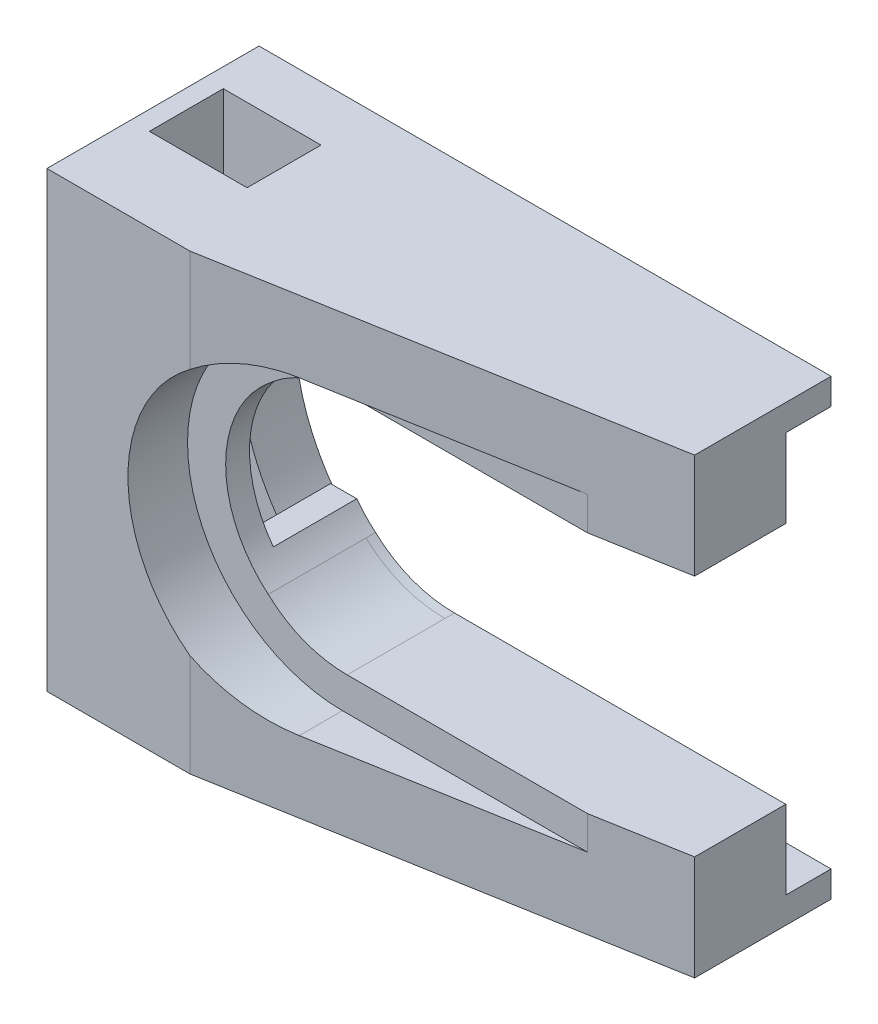
ISO-10303-21;
HEADER;
FILE_DESCRIPTION(('STEP AP214'),'2;1');
FILE_NAME('part.step','',(''),(''),'','','');
FILE_SCHEMA(('AUTOMOTIVE_DESIGN { 1 0 10303 214 1 1 1 1 }'));
ENDSEC;
DATA;
#1=APPLICATION_CONTEXT('core data for automotive mechanical design processes');
#2=APPLICATION_PROTOCOL_DEFINITION('international standard','automotive_design',2000,#1);
#3=PRODUCT_CONTEXT('',#1,'mechanical');
#4=PRODUCT('Part','Part','',(#3));
#5=PRODUCT_RELATED_PRODUCT_CATEGORY('part','',(#4));
#6=PRODUCT_DEFINITION_FORMATION('','',#4);
#7=PRODUCT_DEFINITION_CONTEXT('part definition',#1,'design');
#8=PRODUCT_DEFINITION('design','',#6,#7);
#9=PRODUCT_DEFINITION_SHAPE('','',#8);
#10=(LENGTH_UNIT() NAMED_UNIT(*) SI_UNIT(.MILLI.,.METRE.));
#11=(NAMED_UNIT(*) PLANE_ANGLE_UNIT() SI_UNIT($,.RADIAN.));
#12=(NAMED_UNIT(*) SI_UNIT($,.STERADIAN.) SOLID_ANGLE_UNIT());
#13=UNCERTAINTY_MEASURE_WITH_UNIT(LENGTH_MEASURE(1.E-05),#10,'distance_accuracy_value','');
#14=(GEOMETRIC_REPRESENTATION_CONTEXT(3) GLOBAL_UNCERTAINTY_ASSIGNED_CONTEXT((#13)) GLOBAL_UNIT_ASSIGNED_CONTEXT((#10,
#11,#12)) REPRESENTATION_CONTEXT('',''));
#15=CARTESIAN_POINT('',(0.,0.,0.));
#16=DIRECTION('',(0.,0.,1.));
#17=DIRECTION('',(1.,0.,0.));
#18=AXIS2_PLACEMENT_3D('',#15,#16,#17);
#19=CARTESIAN_POINT('',(12.,-9.5,33.));
#20=DIRECTION('',(-1.,0.,0.));
#21=DIRECTION('',(0.,0.,1.));
#22=AXIS2_PLACEMENT_3D('',#19,#20,#21);
#23=PLANE('',#22);
#24=DIRECTION('',(0.,0.,1.));
#25=VECTOR('',#24,1.);
#26=CARTESIAN_POINT('',(12.,8.4,23.1));
#27=LINE('',#26,#25);
#28=CARTESIAN_POINT('',(12.,8.4,23.1));
#29=VERTEX_POINT('',#28);
#30=CARTESIAN_POINT('',(12.,8.4,25.));
#31=VERTEX_POINT('',#30);
#32=EDGE_CURVE('E283',#29,#31,#27,.T.);
#33=ORIENTED_EDGE('',*,*,#32,.F.);
#34=DIRECTION('',(0.,1.,0.));
#35=VECTOR('',#34,1.);
#36=CARTESIAN_POINT('',(12.,-9.5,23.1));
#37=LINE('',#36,#35);
#38=CARTESIAN_POINT('',(12.,9.5,23.1));
#39=VERTEX_POINT('',#38);
#40=EDGE_CURVE('E345',#29,#39,#37,.T.);
#41=ORIENTED_EDGE('',*,*,#40,.T.);
#42=DIRECTION('',(0.,0.,-1.));
#43=VECTOR('',#42,1.);
#44=CARTESIAN_POINT('',(12.,9.5,33.));
#45=LINE('',#44,#43);
#46=CARTESIAN_POINT('',(12.,9.5,28.8261143472478));
#47=VERTEX_POINT('',#46);
#48=EDGE_CURVE('E618',#47,#39,#45,.T.);
#49=ORIENTED_EDGE('',*,*,#48,.F.);
#50=DIRECTION('',(0.,-1.,0.));
#51=VECTOR('',#50,1.);
#52=CARTESIAN_POINT('',(12.,9.5,28.8261143472478));
#53=LINE('',#52,#51);
#54=CARTESIAN_POINT('',(12.,5.1,28.8261143472478));
#55=VERTEX_POINT('',#54);
#56=EDGE_CURVE('E470',#47,#55,#53,.T.);
#57=ORIENTED_EDGE('',*,*,#56,.T.);
#58=DIRECTION('',(0.,0.,1.));
#59=VECTOR('',#58,1.);
#60=CARTESIAN_POINT('',(12.,5.1,-0.001000000000001));
#61=LINE('',#60,#59);
#62=CARTESIAN_POINT('',(12.,5.1,25.));
#63=VERTEX_POINT('',#62);
#64=EDGE_CURVE('E603',#63,#55,#61,.T.);
#65=ORIENTED_EDGE('',*,*,#64,.F.);
#66=DIRECTION('',(0.,-1.,0.));
#67=VECTOR('',#66,1.);
#68=CARTESIAN_POINT('',(12.,8.4,25.));
#69=LINE('',#68,#67);
#70=EDGE_CURVE('E349',#31,#63,#69,.T.);
#71=ORIENTED_EDGE('',*,*,#70,.F.);
#72=EDGE_LOOP('',(#33,#41,#49,#57,#65,#71));
#73=FACE_BOUND('',#72,.T.);
#74=ADVANCED_FACE('F45',(#73),#23,.F.);
#75=CARTESIAN_POINT('',(-2.,0.,23.1));
#76=DIRECTION('',(0.,0.,1.));
#77=DIRECTION('',(1.,0.,0.));
#78=AXIS2_PLACEMENT_3D('',#75,#76,#77);
#79=CYLINDRICAL_SURFACE('',#78,8.5);
#80=DIRECTION('',(0.,0.,1.));
#81=VECTOR('',#80,1.);
#82=CARTESIAN_POINT('',(-7.1,6.8,16.5613982200841));
#83=LINE('',#82,#81);
#84=CARTESIAN_POINT('',(-7.1,6.8,25.));
#85=VERTEX_POINT('',#84);
#86=CARTESIAN_POINT('',(-7.1,6.8,25.4));
#87=VERTEX_POINT('',#86);
#88=EDGE_CURVE('E664',#85,#87,#83,.T.);
#89=ORIENTED_EDGE('',*,*,#88,.T.);
#90=CARTESIAN_POINT('',(-2.,0.,25.4));
#91=DIRECTION('',(0.,0.,1.));
#92=DIRECTION('',(1.,0.,0.));
#93=AXIS2_PLACEMENT_3D('',#90,#91,#92);
#94=CIRCLE('',#93,8.5);
#95=CARTESIAN_POINT('',(-7.1,-6.8,25.4));
#96=VERTEX_POINT('',#95);
#97=EDGE_CURVE('E404',#87,#96,#94,.T.);
#98=ORIENTED_EDGE('',*,*,#97,.T.);
#99=DIRECTION('',(0.,0.,1.));
#100=VECTOR('',#99,1.);
#101=CARTESIAN_POINT('',(-7.1,-6.8,16.5613982200841));
#102=LINE('',#101,#100);
#103=CARTESIAN_POINT('',(-7.1,-6.8,25.));
#104=VERTEX_POINT('',#103);
#105=EDGE_CURVE('E505',#104,#96,#102,.T.);
#106=ORIENTED_EDGE('',*,*,#105,.F.);
#107=CARTESIAN_POINT('',(-2.,0.,25.));
#108=DIRECTION('',(0.,0.,1.));
#109=DIRECTION('',(1.,0.,0.));
#110=AXIS2_PLACEMENT_3D('',#107,#108,#109);
#111=CIRCLE('',#110,8.5);
#112=CARTESIAN_POINT('',(-0.700000000000006,-8.4,25.));
#113=VERTEX_POINT('',#112);
#114=EDGE_CURVE('E487',#104,#113,#111,.T.);
#115=ORIENTED_EDGE('',*,*,#114,.T.);
#116=DIRECTION('',(0.,0.,1.));
#117=VECTOR('',#116,1.);
#118=CARTESIAN_POINT('',(-0.700000000000001,-8.4,23.1));
#119=LINE('',#118,#117);
#120=CARTESIAN_POINT('',(-0.700000000000001,-8.4,23.1));
#121=VERTEX_POINT('',#120);
#122=EDGE_CURVE('E284',#121,#113,#119,.T.);
#123=ORIENTED_EDGE('',*,*,#122,.F.);
#124=CARTESIAN_POINT('',(-2.,0.,23.1));
#125=DIRECTION('',(0.,0.,1.));
#126=DIRECTION('',(1.,0.,0.));
#127=AXIS2_PLACEMENT_3D('',#124,#125,#126);
#128=CIRCLE('',#127,8.5);
#129=CARTESIAN_POINT('',(-0.700000000000001,8.4,23.1));
#130=VERTEX_POINT('',#129);
#131=EDGE_CURVE('E261',#130,#121,#128,.T.);
#132=ORIENTED_EDGE('',*,*,#131,.F.);
#133=DIRECTION('',(0.,0.,1.));
#134=VECTOR('',#133,1.);
#135=CARTESIAN_POINT('',(-0.700000000000001,8.4,23.1));
#136=LINE('',#135,#134);
#137=CARTESIAN_POINT('',(-0.7,8.4,25.));
#138=VERTEX_POINT('',#137);
#139=EDGE_CURVE('E287',#130,#138,#136,.T.);
#140=ORIENTED_EDGE('',*,*,#139,.T.);
#141=CARTESIAN_POINT('',(-2.,0.,25.));
#142=DIRECTION('',(0.,0.,1.));
#143=DIRECTION('',(1.,0.,0.));
#144=AXIS2_PLACEMENT_3D('',#141,#142,#143);
#145=CIRCLE('',#144,8.5);
#146=EDGE_CURVE('E364',#138,#85,#145,.T.);
#147=ORIENTED_EDGE('',*,*,#146,.T.);
#148=EDGE_LOOP('',(#89,#98,#106,#115,#123,#132,#140,#147));
#149=FACE_BOUND('',#148,.T.);
#150=ADVANCED_FACE('F319',(#149),#79,.F.);
#151=DIRECTION('',(0.,0.,-1.));
#152=VECTOR('',#151,1.);
#153=CARTESIAN_POINT('',(12.,-9.5,33.));
#154=LINE('',#153,#152);
#155=CARTESIAN_POINT('',(12.,-9.5,28.8261143472478));
#156=VERTEX_POINT('',#155);
#157=CARTESIAN_POINT('',(12.,-9.5,23.1));
#158=VERTEX_POINT('',#157);
#159=EDGE_CURVE('E276',#156,#158,#154,.T.);
#160=ORIENTED_EDGE('',*,*,#159,.T.);
#161=DIRECTION('',(0.,1.,0.));
#162=VECTOR('',#161,1.);
#163=CARTESIAN_POINT('',(12.,-9.5,23.1));
#164=LINE('',#163,#162);
#165=CARTESIAN_POINT('',(12.,-8.4,23.1));
#166=VERTEX_POINT('',#165);
#167=EDGE_CURVE('E258',#158,#166,#164,.T.);
#168=ORIENTED_EDGE('',*,*,#167,.T.);
#169=DIRECTION('',(0.,0.,1.));
#170=VECTOR('',#169,1.);
#171=CARTESIAN_POINT('',(12.,-8.4,23.1));
#172=LINE('',#171,#170);
#173=CARTESIAN_POINT('',(12.,-8.4,25.));
#174=VERTEX_POINT('',#173);
#175=EDGE_CURVE('E273',#166,#174,#172,.T.);
#176=ORIENTED_EDGE('',*,*,#175,.T.);
#177=CARTESIAN_POINT('',(12.,-5.1,25.));
#178=VERTEX_POINT('',#177);
#179=EDGE_CURVE('E361',#178,#174,#69,.T.);
#180=ORIENTED_EDGE('',*,*,#179,.F.);
#181=DIRECTION('',(0.,0.,1.));
#182=VECTOR('',#181,1.);
#183=CARTESIAN_POINT('',(12.,-5.1,-0.001000000000001));
#184=LINE('',#183,#182);
#185=CARTESIAN_POINT('',(12.,-5.1,28.8261143472478));
#186=VERTEX_POINT('',#185);
#187=EDGE_CURVE('E600',#178,#186,#184,.T.);
#188=ORIENTED_EDGE('',*,*,#187,.T.);
#189=EDGE_CURVE('E473',#186,#156,#53,.T.);
#190=ORIENTED_EDGE('',*,*,#189,.T.);
#191=EDGE_LOOP('',(#160,#168,#176,#180,#188,#190));
#192=FACE_BOUND('',#191,.T.);
#193=ADVANCED_FACE('F271',(#192),#23,.F.);
#194=CARTESIAN_POINT('',(-1.9,5.1,-0.001000000000001));
#195=CARTESIAN_POINT('',(-3.82912407346353,5.09320531687045,-0.001000000000001));
#196=CARTESIAN_POINT('',(-5.21393804843269,3.8302222155949,-0.001000000000001));
#197=B_SPLINE_CURVE_WITH_KNOTS('',2,(#194,#195,#196),.UNSPECIFIED.,.F.,.F.,(3,3),(0.,1.),.UNSPECIFIED.);
#198=DIRECTION('',(0.,0.,1.));
#199=VECTOR('',#198,1.);
#200=SURFACE_OF_LINEAR_EXTRUSION('',#197,#199);
#201=CARTESIAN_POINT('',(-1.9,5.1,29.5));
#202=CARTESIAN_POINT('',(-3.82912407346353,5.09320531687045,29.5));
#203=CARTESIAN_POINT('',(-5.21393804843269,3.8302222155949,29.5));
#204=B_SPLINE_CURVE_WITH_KNOTS('',2,(#201,#202,#203),.UNSPECIFIED.,.F.,.F.,(3,3),(0.,1.),.UNSPECIFIED.);
#205=CARTESIAN_POINT('',(-5.21393804843269,3.8302222155949,29.5));
#206=VERTEX_POINT('',#205);
#207=CARTESIAN_POINT('',(-1.9,5.1,29.5));
#208=VERTEX_POINT('',#207);
#209=EDGE_CURVE('E412',#206,#208,#204,.F.);
#210=ORIENTED_EDGE('',*,*,#209,.F.);
#211=DIRECTION('',(0.,0.,1.));
#212=VECTOR('',#211,1.);
#213=CARTESIAN_POINT('',(-5.21393804843269,3.8302222155949,-0.001000000000001));
#214=LINE('',#213,#212);
#215=CARTESIAN_POINT('',(-5.21393804843269,3.8302222155949,25.4));
#216=VERTEX_POINT('',#215);
#217=EDGE_CURVE('E296',#216,#206,#214,.T.);
#218=ORIENTED_EDGE('',*,*,#217,.F.);
#219=CARTESIAN_POINT('',(-1.9,5.1,25.4));
#220=CARTESIAN_POINT('',(-3.82912407346353,5.09320531687045,25.4));
#221=CARTESIAN_POINT('',(-5.21393804843269,3.8302222155949,25.4));
#222=B_SPLINE_CURVE_WITH_KNOTS('',2,(#219,#220,#221),.UNSPECIFIED.,.F.,.F.,(3,3),(0.,1.),.UNSPECIFIED.);
#223=CARTESIAN_POINT('',(-1.9,5.1,25.4));
#224=VERTEX_POINT('',#223);
#225=EDGE_CURVE('E407',#224,#216,#222,.T.);
#226=ORIENTED_EDGE('',*,*,#225,.F.);
#227=DIRECTION('',(0.,0.,1.));
#228=VECTOR('',#227,1.);
#229=CARTESIAN_POINT('',(-1.9,5.1,-0.001000000000001));
#230=LINE('',#229,#228);
#231=EDGE_CURVE('E610',#224,#208,#230,.T.);
#232=ORIENTED_EDGE('',*,*,#231,.T.);
#233=EDGE_LOOP('',(#210,#218,#226,#232));
#234=FACE_BOUND('',#233,.T.);
#235=ADVANCED_FACE('F309',(#234),#200,.F.);
#236=CARTESIAN_POINT('',(-1.9,5.1,-0.001000000000001));
#237=DIRECTION('',(0.,1.,0.));
#238=DIRECTION('',(0.,0.,1.));
#239=AXIS2_PLACEMENT_3D('',#236,#237,#238);
#240=PLANE('',#239);
#241=ORIENTED_EDGE('',*,*,#231,.F.);
#242=DIRECTION('',(0.,0.,1.));
#243=VECTOR('',#242,1.);
#244=CARTESIAN_POINT('',(-1.9,5.1,16.5613982200841));
#245=LINE('',#244,#243);
#246=CARTESIAN_POINT('',(-1.9000000000069,5.10000000009578,25.));
#247=VERTEX_POINT('',#246);
#248=EDGE_CURVE('E659',#247,#224,#245,.T.);
#249=ORIENTED_EDGE('',*,*,#248,.F.);
#250=DIRECTION('',(1.,0.,0.));
#251=VECTOR('',#250,1.);
#252=CARTESIAN_POINT('',(-1.9,5.1,25.));
#253=LINE('',#252,#251);
#254=EDGE_CURVE('E294',#247,#63,#253,.T.);
#255=ORIENTED_EDGE('',*,*,#254,.T.);
#256=ORIENTED_EDGE('',*,*,#64,.T.);
#257=DIRECTION('',(-0.984807753012209,0.,0.173648177666923));
#258=VECTOR('',#257,1.);
#259=CARTESIAN_POINT('',(3.44886317589326,5.1,30.3339104850674));
#260=LINE('',#259,#258);
#261=CARTESIAN_POINT('',(8.17820454904488,5.1,29.5));
#262=VERTEX_POINT('',#261);
#263=EDGE_CURVE('E460',#55,#262,#260,.T.);
#264=ORIENTED_EDGE('',*,*,#263,.T.);
#265=DIRECTION('',(1.,0.,0.));
#266=VECTOR('',#265,1.);
#267=CARTESIAN_POINT('',(-1.9,5.1,29.5));
#268=LINE('',#267,#266);
#269=EDGE_CURVE('E408',#208,#262,#268,.T.);
#270=ORIENTED_EDGE('',*,*,#269,.F.);
#271=EDGE_LOOP('',(#241,#249,#255,#256,#264,#270));
#272=FACE_BOUND('',#271,.T.);
#273=ADVANCED_FACE('F313',(#272),#240,.F.);
#274=CARTESIAN_POINT('',(-1.9,-5.1,-0.001000000000001));
#275=DIRECTION('',(0.,-1.,0.));
#276=DIRECTION('',(0.,0.,-1.));
#277=AXIS2_PLACEMENT_3D('',#274,#275,#276);
#278=PLANE('',#277);
#279=DIRECTION('',(-1.,0.,0.));
#280=VECTOR('',#279,1.);
#281=CARTESIAN_POINT('',(-1.9,-5.1,29.5));
#282=LINE('',#281,#280);
#283=CARTESIAN_POINT('',(8.17820454904488,-5.1,29.5));
#284=VERTEX_POINT('',#283);
#285=CARTESIAN_POINT('',(-1.9,-5.1,29.5));
#286=VERTEX_POINT('',#285);
#287=EDGE_CURVE('E416',#284,#286,#282,.T.);
#288=ORIENTED_EDGE('',*,*,#287,.F.);
#289=DIRECTION('',(0.984807753012209,0.,-0.173648177666923));
#290=VECTOR('',#289,1.);
#291=CARTESIAN_POINT('',(3.44886317589326,-5.1,30.3339104850674));
#292=LINE('',#291,#290);
#293=EDGE_CURVE('E452',#284,#186,#292,.T.);
#294=ORIENTED_EDGE('',*,*,#293,.T.);
#295=ORIENTED_EDGE('',*,*,#187,.F.);
#296=DIRECTION('',(-1.,0.,0.));
#297=VECTOR('',#296,1.);
#298=CARTESIAN_POINT('',(-1.9,-5.1,25.));
#299=LINE('',#298,#297);
#300=CARTESIAN_POINT('',(-1.89999996753942,-5.1,25.));
#301=VERTEX_POINT('',#300);
#302=EDGE_CURVE('E292',#178,#301,#299,.T.);
#303=ORIENTED_EDGE('',*,*,#302,.T.);
#304=DIRECTION('',(0.,0.,1.));
#305=VECTOR('',#304,1.);
#306=CARTESIAN_POINT('',(-1.89999996753942,-5.09999999997975,16.5613982200841));
#307=LINE('',#306,#305);
#308=CARTESIAN_POINT('',(-1.9,-5.1,25.4));
#309=VERTEX_POINT('',#308);
#310=EDGE_CURVE('E598',#301,#309,#307,.T.);
#311=ORIENTED_EDGE('',*,*,#310,.T.);
#312=DIRECTION('',(0.,0.,1.));
#313=VECTOR('',#312,1.);
#314=CARTESIAN_POINT('',(-1.9,-5.1,-0.001000000000001));
#315=LINE('',#314,#313);
#316=EDGE_CURVE('E591',#309,#286,#315,.T.);
#317=ORIENTED_EDGE('',*,*,#316,.T.);
#318=EDGE_LOOP('',(#288,#294,#295,#303,#311,#317));
#319=FACE_BOUND('',#318,.T.);
#320=ADVANCED_FACE('F577',(#319),#278,.F.);
#321=CARTESIAN_POINT('',(-5.21393804843269,-3.8302222155949,-0.001000000000001));
#322=CARTESIAN_POINT('',(-3.82912407346353,-5.09320531687045,-0.001000000000001));
#323=CARTESIAN_POINT('',(-1.9,-5.1,-0.001000000000001));
#324=B_SPLINE_CURVE_WITH_KNOTS('',2,(#321,#322,#323),.UNSPECIFIED.,.F.,.F.,(3,3),(0.,1.),.UNSPECIFIED.);
#325=DIRECTION('',(0.,0.,1.));
#326=VECTOR('',#325,1.);
#327=SURFACE_OF_LINEAR_EXTRUSION('',#324,#326);
#328=CARTESIAN_POINT('',(-5.21393804843269,-3.8302222155949,29.5));
#329=CARTESIAN_POINT('',(-3.82912407346353,-5.09320531687045,29.5));
#330=CARTESIAN_POINT('',(-1.9,-5.1,29.5));
#331=B_SPLINE_CURVE_WITH_KNOTS('',2,(#328,#329,#330),.UNSPECIFIED.,.F.,.F.,(3,3),(0.,1.),.UNSPECIFIED.);
#332=CARTESIAN_POINT('',(-5.21393804843269,-3.8302222155949,29.5));
#333=VERTEX_POINT('',#332);
#334=EDGE_CURVE('E421',#286,#333,#331,.F.);
#335=ORIENTED_EDGE('',*,*,#334,.F.);
#336=ORIENTED_EDGE('',*,*,#316,.F.);
#337=CARTESIAN_POINT('',(-5.21393804843269,-3.8302222155949,25.4));
#338=CARTESIAN_POINT('',(-3.82912407346353,-5.09320531687045,25.4));
#339=CARTESIAN_POINT('',(-1.9,-5.1,25.4));
#340=B_SPLINE_CURVE_WITH_KNOTS('',2,(#337,#338,#339),.UNSPECIFIED.,.F.,.F.,(3,3),(0.,1.),.UNSPECIFIED.);
#341=CARTESIAN_POINT('',(-5.21393804843269,-3.8302222155949,25.4));
#342=VERTEX_POINT('',#341);
#343=EDGE_CURVE('E411',#342,#309,#340,.T.);
#344=ORIENTED_EDGE('',*,*,#343,.F.);
#345=DIRECTION('',(0.,0.,1.));
#346=VECTOR('',#345,1.);
#347=CARTESIAN_POINT('',(-5.21393804843269,-3.8302222155949,-0.001000000000001));
#348=LINE('',#347,#346);
#349=EDGE_CURVE('E594',#342,#333,#348,.T.);
#350=ORIENTED_EDGE('',*,*,#349,.T.);
#351=EDGE_LOOP('',(#335,#336,#344,#350));
#352=FACE_BOUND('',#351,.T.);
#353=ADVANCED_FACE('F580',(#352),#327,.F.);
#354=CARTESIAN_POINT('',(-2.,0.,-0.001000000000001));
#355=DIRECTION('',(0.,0.,1.));
#356=DIRECTION('',(1.,0.,0.));
#357=AXIS2_PLACEMENT_3D('',#354,#355,#356);
#358=CYLINDRICAL_SURFACE('',#357,5.);
#359=CARTESIAN_POINT('',(-2.,0.,29.5));
#360=DIRECTION('',(0.,0.,1.));
#361=DIRECTION('',(1.,0.,0.));
#362=AXIS2_PLACEMENT_3D('',#359,#360,#361);
#363=CIRCLE('',#362,5.);
#364=EDGE_CURVE('E624',#333,#206,#363,.F.);
#365=ORIENTED_EDGE('',*,*,#364,.F.);
#366=ORIENTED_EDGE('',*,*,#349,.F.);
#367=DIRECTION('',(0.,0.,1.));
#368=VECTOR('',#367,1.);
#369=CARTESIAN_POINT('',(-5.21393804843269,-3.8302222155949,16.5613982200841));
#370=LINE('',#369,#368);
#371=CARTESIAN_POINT('',(-5.21393804832737,-3.83022221548701,25.));
#372=VERTEX_POINT('',#371);
#373=EDGE_CURVE('E668',#372,#342,#370,.T.);
#374=ORIENTED_EDGE('',*,*,#373,.F.);
#375=CARTESIAN_POINT('',(-2.,0.,25.));
#376=DIRECTION('',(0.,0.,1.));
#377=DIRECTION('',(1.,0.,0.));
#378=AXIS2_PLACEMENT_3D('',#375,#376,#377);
#379=CIRCLE('',#378,5.);
#380=CARTESIAN_POINT('',(-6.00000000000001,-2.99999999999999,25.));
#381=VERTEX_POINT('',#380);
#382=EDGE_CURVE('E488',#372,#381,#379,.F.);
#383=ORIENTED_EDGE('',*,*,#382,.T.);
#384=DIRECTION('',(0.,0.,1.));
#385=VECTOR('',#384,1.);
#386=CARTESIAN_POINT('',(-6.00000000000002,-2.99999999999998,-0.00100000000000142));
#387=LINE('',#386,#385);
#388=CARTESIAN_POINT('',(-6.00000000000001,-2.99999999999999,28.5));
#389=VERTEX_POINT('',#388);
#390=EDGE_CURVE('E381',#381,#389,#387,.T.);
#391=ORIENTED_EDGE('',*,*,#390,.T.);
#392=CARTESIAN_POINT('',(-2.,0.,28.5));
#393=DIRECTION('',(0.,0.,1.));
#394=DIRECTION('',(1.,0.,0.));
#395=AXIS2_PLACEMENT_3D('',#392,#393,#394);
#396=CIRCLE('',#395,5.);
#397=CARTESIAN_POINT('',(-5.99999999999999,3.00000000000001,28.5));
#398=VERTEX_POINT('',#397);
#399=EDGE_CURVE('E397',#389,#398,#396,.F.);
#400=ORIENTED_EDGE('',*,*,#399,.T.);
#401=DIRECTION('',(0.,0.,1.));
#402=VECTOR('',#401,1.);
#403=CARTESIAN_POINT('',(-5.99999999999999,3.00000000000001,-0.00100000000000142));
#404=LINE('',#403,#402);
#405=CARTESIAN_POINT('',(-5.99999999999999,3.00000000000001,25.));
#406=VERTEX_POINT('',#405);
#407=EDGE_CURVE('E395',#398,#406,#404,.F.);
#408=ORIENTED_EDGE('',*,*,#407,.T.);
#409=CARTESIAN_POINT('',(-2.,0.,25.));
#410=DIRECTION('',(0.,0.,1.));
#411=DIRECTION('',(1.,0.,0.));
#412=AXIS2_PLACEMENT_3D('',#409,#410,#411);
#413=CIRCLE('',#412,5.);
#414=CARTESIAN_POINT('',(-5.21393805135695,3.83022221307516,25.));
#415=VERTEX_POINT('',#414);
#416=EDGE_CURVE('E674',#406,#415,#413,.F.);
#417=ORIENTED_EDGE('',*,*,#416,.T.);
#418=DIRECTION('',(0.,0.,1.));
#419=VECTOR('',#418,1.);
#420=CARTESIAN_POINT('',(-5.21393805135695,3.83022221307516,16.5613982200841));
#421=LINE('',#420,#419);
#422=EDGE_CURVE('E656',#415,#216,#421,.T.);
#423=ORIENTED_EDGE('',*,*,#422,.T.);
#424=ORIENTED_EDGE('',*,*,#217,.T.);
#425=EDGE_LOOP('',(#365,#366,#374,#383,#391,#400,#408,#417,#423,#424));
#426=FACE_BOUND('',#425,.T.);
#427=ADVANCED_FACE('F315',(#426),#358,.F.);
#428=CARTESIAN_POINT('',(-2.,0.,25.));
#429=DIRECTION('',(0.,0.,1.));
#430=DIRECTION('',(1.,0.,0.));
#431=AXIS2_PLACEMENT_3D('',#428,#429,#430);
#432=PLANE('',#431);
#433=DIRECTION('',(1.,0.,0.));
#434=VECTOR('',#433,1.);
#435=CARTESIAN_POINT('',(-0.700000000000001,-8.4,25.));
#436=LINE('',#435,#434);
#437=EDGE_CURVE('E282',#113,#174,#436,.T.);
#438=ORIENTED_EDGE('',*,*,#437,.F.);
#439=ORIENTED_EDGE('',*,*,#114,.F.);
#440=DIRECTION('',(0.,-1.,0.));
#441=VECTOR('',#440,1.);
#442=CARTESIAN_POINT('',(-7.1,-6.8,25.));
#443=LINE('',#442,#441);
#444=CARTESIAN_POINT('',(-7.1,-2.99999999999999,25.));
#445=VERTEX_POINT('',#444);
#446=EDGE_CURVE('E497',#445,#104,#443,.T.);
#447=ORIENTED_EDGE('',*,*,#446,.F.);
#448=DIRECTION('',(-1.,0.,0.));
#449=VECTOR('',#448,1.);
#450=CARTESIAN_POINT('',(-7.1,-2.99999999999999,25.));
#451=LINE('',#450,#449);
#452=EDGE_CURVE('E494',#381,#445,#451,.T.);
#453=ORIENTED_EDGE('',*,*,#452,.F.);
#454=ORIENTED_EDGE('',*,*,#382,.F.);
#455=CARTESIAN_POINT('',(394799.590876836,918765.889849211,25.));
#456=CARTESIAN_POINT('',(-397587.81203794,-917570.513487616,25.));
#457=CARTESIAN_POINT('',(400360.529649035,916356.318890673,25.));
#458=B_SPLINE_CURVE_WITH_KNOTS('',2,(#455,#456,#457),.UNSPECIFIED.,.F.,.F.,(3,3),(0.,1.),.UNSPECIFIED.);
#459=EDGE_CURVE('E482',#301,#372,#458,.F.);
#460=ORIENTED_EDGE('',*,*,#459,.F.);
#461=ORIENTED_EDGE('',*,*,#302,.F.);
#462=ORIENTED_EDGE('',*,*,#179,.T.);
#463=EDGE_LOOP('',(#438,#439,#447,#453,#454,#460,#461,#462));
#464=FACE_BOUND('',#463,.T.);
#465=ADVANCED_FACE('F330',(#464),#432,.F.);
#466=CARTESIAN_POINT('',(-12.,9.5,33.));
#467=DIRECTION('',(0.,-1.,0.));
#468=DIRECTION('',(0.,0.,-1.));
#469=AXIS2_PLACEMENT_3D('',#466,#467,#468);
#470=PLANE('',#469);
#471=DIRECTION('',(-1.,0.,0.));
#472=VECTOR('',#471,1.);
#473=CARTESIAN_POINT('',(-7.1,9.5,28.5));
#474=LINE('',#473,#472);
#475=CARTESIAN_POINT('',(-7.1,9.5,28.5));
#476=VERTEX_POINT('',#475);
#477=CARTESIAN_POINT('',(-11.2,9.5,28.5));
#478=VERTEX_POINT('',#477);
#479=EDGE_CURVE('E362',#476,#478,#474,.T.);
#480=ORIENTED_EDGE('',*,*,#479,.T.);
#481=DIRECTION('',(0.,0.,-1.));
#482=VECTOR('',#481,1.);
#483=CARTESIAN_POINT('',(-11.2,9.5,28.5));
#484=LINE('',#483,#482);
#485=CARTESIAN_POINT('',(-11.2,9.5,25.4));
#486=VERTEX_POINT('',#485);
#487=EDGE_CURVE('E500',#478,#486,#484,.T.);
#488=ORIENTED_EDGE('',*,*,#487,.T.);
#489=DIRECTION('',(-1.,0.,0.));
#490=VECTOR('',#489,1.);
#491=CARTESIAN_POINT('',(-7.1,9.5,25.4));
#492=LINE('',#491,#490);
#493=CARTESIAN_POINT('',(-7.1,9.5,25.4));
#494=VERTEX_POINT('',#493);
#495=EDGE_CURVE('E67',#494,#486,#492,.T.);
#496=ORIENTED_EDGE('',*,*,#495,.F.);
#497=DIRECTION('',(0.,0.,-1.));
#498=VECTOR('',#497,1.);
#499=CARTESIAN_POINT('',(-7.1,9.5,28.5));
#500=LINE('',#499,#498);
#501=EDGE_CURVE('E370',#476,#494,#500,.T.);
#502=ORIENTED_EDGE('',*,*,#501,.F.);
#503=EDGE_LOOP('',(#480,#488,#496,#502));
#504=FACE_BOUND('',#503,.T.);
#505=ORIENTED_EDGE('',*,*,#48,.T.);
#506=DIRECTION('',(-1.,0.,0.));
#507=VECTOR('',#506,1.);
#508=CARTESIAN_POINT('',(-12.,9.5,23.1));
#509=LINE('',#508,#507);
#510=CARTESIAN_POINT('',(-12.,9.5,23.1));
#511=VERTEX_POINT('',#510);
#512=EDGE_CURVE('E706',#39,#511,#509,.T.);
#513=ORIENTED_EDGE('',*,*,#512,.T.);
#514=DIRECTION('',(0.,0.,-1.));
#515=VECTOR('',#514,1.);
#516=CARTESIAN_POINT('',(-12.,9.5,33.));
#517=LINE('',#516,#515);
#518=CARTESIAN_POINT('',(-12.,9.49999999999999,32.));
#519=VERTEX_POINT('',#518);
#520=EDGE_CURVE('E627',#519,#511,#517,.T.);
#521=ORIENTED_EDGE('',*,*,#520,.F.);
#522=DIRECTION('',(-1.,0.,0.));
#523=VECTOR('',#522,1.);
#524=CARTESIAN_POINT('',(41.98,9.5,32.));
#525=LINE('',#524,#523);
#526=CARTESIAN_POINT('',(-5.99999999999998,9.49999999999999,32.));
#527=VERTEX_POINT('',#526);
#528=EDGE_CURVE('E449',#527,#519,#525,.T.);
#529=ORIENTED_EDGE('',*,*,#528,.F.);
#530=DIRECTION('',(0.984807753012209,0.,-0.173648177666923));
#531=VECTOR('',#530,1.);
#532=CARTESIAN_POINT('',(-6.,9.5,32.));
#533=LINE('',#532,#531);
#534=EDGE_CURVE('E474',#527,#47,#533,.T.);
#535=ORIENTED_EDGE('',*,*,#534,.T.);
#536=EDGE_LOOP('',(#505,#513,#521,#529,#535));
#537=FACE_BOUND('',#536,.T.);
#538=ADVANCED_FACE('F47',(#504,#537),#470,.F.);
#539=CARTESIAN_POINT('',(-12.,-9.5,33.));
#540=DIRECTION('',(1.,0.,0.));
#541=DIRECTION('',(0.,0.,-1.));
#542=AXIS2_PLACEMENT_3D('',#539,#540,#541);
#543=PLANE('',#542);
#544=ORIENTED_EDGE('',*,*,#520,.T.);
#545=DIRECTION('',(0.,-1.,0.));
#546=VECTOR('',#545,1.);
#547=CARTESIAN_POINT('',(-12.,-9.5,23.1));
#548=LINE('',#547,#546);
#549=CARTESIAN_POINT('',(-12.,-9.5,23.1));
#550=VERTEX_POINT('',#549);
#551=EDGE_CURVE('E647',#511,#550,#548,.T.);
#552=ORIENTED_EDGE('',*,*,#551,.T.);
#553=DIRECTION('',(0.,0.,-1.));
#554=VECTOR('',#553,1.);
#555=CARTESIAN_POINT('',(-12.,-9.5,33.));
#556=LINE('',#555,#554);
#557=CARTESIAN_POINT('',(-12.,-9.5,32.));
#558=VERTEX_POINT('',#557);
#559=EDGE_CURVE('E629',#558,#550,#556,.T.);
#560=ORIENTED_EDGE('',*,*,#559,.F.);
#561=DIRECTION('',(0.,-1.,0.));
#562=VECTOR('',#561,1.);
#563=CARTESIAN_POINT('',(-12.,9.49999999999999,32.));
#564=LINE('',#563,#562);
#565=EDGE_CURVE('E446',#519,#558,#564,.T.);
#566=ORIENTED_EDGE('',*,*,#565,.F.);
#567=EDGE_LOOP('',(#544,#552,#560,#566));
#568=FACE_BOUND('',#567,.T.);
#569=ADVANCED_FACE('F323',(#568),#543,.F.);
#570=CARTESIAN_POINT('',(-12.,-9.5,33.));
#571=DIRECTION('',(0.,1.,0.));
#572=DIRECTION('',(0.,0.,1.));
#573=AXIS2_PLACEMENT_3D('',#570,#571,#572);
#574=PLANE('',#573);
#575=ORIENTED_EDGE('',*,*,#559,.T.);
#576=DIRECTION('',(1.,0.,0.));
#577=VECTOR('',#576,1.);
#578=CARTESIAN_POINT('',(-12.,-9.5,23.1));
#579=LINE('',#578,#577);
#580=EDGE_CURVE('E278',#550,#158,#579,.T.);
#581=ORIENTED_EDGE('',*,*,#580,.T.);
#582=ORIENTED_EDGE('',*,*,#159,.F.);
#583=DIRECTION('',(0.984807753012209,0.,-0.173648177666923));
#584=VECTOR('',#583,1.);
#585=CARTESIAN_POINT('',(-6.,-9.5,32.));
#586=LINE('',#585,#584);
#587=CARTESIAN_POINT('',(-6.,-9.5,32.));
#588=VERTEX_POINT('',#587);
#589=EDGE_CURVE('E477',#588,#156,#586,.T.);
#590=ORIENTED_EDGE('',*,*,#589,.F.);
#591=DIRECTION('',(1.,0.,0.));
#592=VECTOR('',#591,1.);
#593=CARTESIAN_POINT('',(41.98,-9.49999999999999,32.));
#594=LINE('',#593,#592);
#595=EDGE_CURVE('E443',#558,#588,#594,.T.);
#596=ORIENTED_EDGE('',*,*,#595,.F.);
#597=EDGE_LOOP('',(#575,#581,#582,#590,#596));
#598=FACE_BOUND('',#597,.T.);
#599=DIRECTION('',(0.,0.,1.));
#600=VECTOR('',#599,1.);
#601=CARTESIAN_POINT('',(-11.2,-9.5,28.5));
#602=LINE('',#601,#600);
#603=CARTESIAN_POINT('',(-11.2,-9.5,25.4));
#604=VERTEX_POINT('',#603);
#605=CARTESIAN_POINT('',(-11.2,-9.5,28.5));
#606=VERTEX_POINT('',#605);
#607=EDGE_CURVE('E277',#604,#606,#602,.T.);
#608=ORIENTED_EDGE('',*,*,#607,.T.);
#609=DIRECTION('',(-1.,0.,0.));
#610=VECTOR('',#609,1.);
#611=CARTESIAN_POINT('',(-7.1,-9.5,28.5));
#612=LINE('',#611,#610);
#613=CARTESIAN_POINT('',(-7.1,-9.5,28.5));
#614=VERTEX_POINT('',#613);
#615=EDGE_CURVE('E378',#614,#606,#612,.T.);
#616=ORIENTED_EDGE('',*,*,#615,.F.);
#617=DIRECTION('',(0.,0.,1.));
#618=VECTOR('',#617,1.);
#619=CARTESIAN_POINT('',(-7.1,-9.5,28.5));
#620=LINE('',#619,#618);
#621=CARTESIAN_POINT('',(-7.1,-9.5,25.4));
#622=VERTEX_POINT('',#621);
#623=EDGE_CURVE('E371',#622,#614,#620,.T.);
#624=ORIENTED_EDGE('',*,*,#623,.F.);
#625=DIRECTION('',(-1.,0.,0.));
#626=VECTOR('',#625,1.);
#627=CARTESIAN_POINT('',(-7.1,-9.5,25.4));
#628=LINE('',#627,#626);
#629=EDGE_CURVE('E377',#622,#604,#628,.T.);
#630=ORIENTED_EDGE('',*,*,#629,.T.);
#631=EDGE_LOOP('',(#608,#616,#624,#630));
#632=FACE_BOUND('',#631,.T.);
#633=ADVANCED_FACE('F320',(#598,#632),#574,.F.);
#634=ORIENTED_EDGE('',*,*,#254,.F.);
#635=CARTESIAN_POINT('',(400360.52964904,-916356.31889067,25.));
#636=CARTESIAN_POINT('',(-397587.812037945,917570.513487614,25.));
#637=CARTESIAN_POINT('',(394799.590876841,-918765.889849208,25.));
#638=B_SPLINE_CURVE_WITH_KNOTS('',2,(#635,#636,#637),.UNSPECIFIED.,.F.,.F.,(3,3),(0.,1.),.UNSPECIFIED.);
#639=EDGE_CURVE('E677',#415,#247,#638,.F.);
#640=ORIENTED_EDGE('',*,*,#639,.F.);
#641=ORIENTED_EDGE('',*,*,#416,.F.);
#642=DIRECTION('',(1.,0.,0.));
#643=VECTOR('',#642,1.);
#644=CARTESIAN_POINT('',(-5.99999999999999,3.00000000000001,25.));
#645=LINE('',#644,#643);
#646=CARTESIAN_POINT('',(-7.1,3.00000000000001,25.));
#647=VERTEX_POINT('',#646);
#648=EDGE_CURVE('E479',#647,#406,#645,.T.);
#649=ORIENTED_EDGE('',*,*,#648,.F.);
#650=DIRECTION('',(0.,-1.,0.));
#651=VECTOR('',#650,1.);
#652=CARTESIAN_POINT('',(-7.1,3.00000000000001,25.));
#653=LINE('',#652,#651);
#654=EDGE_CURVE('E687',#85,#647,#653,.T.);
#655=ORIENTED_EDGE('',*,*,#654,.F.);
#656=ORIENTED_EDGE('',*,*,#146,.F.);
#657=DIRECTION('',(1.,0.,0.));
#658=VECTOR('',#657,1.);
#659=CARTESIAN_POINT('',(-0.700000000000001,8.4,25.));
#660=LINE('',#659,#658);
#661=EDGE_CURVE('E355',#138,#31,#660,.T.);
#662=ORIENTED_EDGE('',*,*,#661,.T.);
#663=ORIENTED_EDGE('',*,*,#70,.T.);
#664=EDGE_LOOP('',(#634,#640,#641,#649,#655,#656,#662,#663));
#665=FACE_BOUND('',#664,.T.);
#666=ADVANCED_FACE('F322',(#665),#432,.F.);
#667=CARTESIAN_POINT('',(-0.700000000000001,8.4,23.1));
#668=DIRECTION('',(0.,-1.,0.));
#669=DIRECTION('',(0.,0.,-1.));
#670=AXIS2_PLACEMENT_3D('',#667,#668,#669);
#671=PLANE('',#670);
#672=ORIENTED_EDGE('',*,*,#661,.F.);
#673=ORIENTED_EDGE('',*,*,#139,.F.);
#674=DIRECTION('',(1.,0.,0.));
#675=VECTOR('',#674,1.);
#676=CARTESIAN_POINT('',(-0.700000000000001,8.4,23.1));
#677=LINE('',#676,#675);
#678=EDGE_CURVE('E266',#130,#29,#677,.T.);
#679=ORIENTED_EDGE('',*,*,#678,.T.);
#680=ORIENTED_EDGE('',*,*,#32,.T.);
#681=EDGE_LOOP('',(#672,#673,#679,#680));
#682=FACE_BOUND('',#681,.T.);
#683=ADVANCED_FACE('F353',(#682),#671,.T.);
#684=CARTESIAN_POINT('',(-0.700000000000001,-8.4,23.1));
#685=DIRECTION('',(0.,-1.,0.));
#686=DIRECTION('',(0.,0.,-1.));
#687=AXIS2_PLACEMENT_3D('',#684,#685,#686);
#688=PLANE('',#687);
#689=ORIENTED_EDGE('',*,*,#437,.T.);
#690=ORIENTED_EDGE('',*,*,#175,.F.);
#691=DIRECTION('',(1.,0.,0.));
#692=VECTOR('',#691,1.);
#693=CARTESIAN_POINT('',(-0.700000000000001,-8.4,23.1));
#694=LINE('',#693,#692);
#695=EDGE_CURVE('E255',#121,#166,#694,.T.);
#696=ORIENTED_EDGE('',*,*,#695,.F.);
#697=ORIENTED_EDGE('',*,*,#122,.T.);
#698=EDGE_LOOP('',(#689,#690,#696,#697));
#699=FACE_BOUND('',#698,.T.);
#700=ADVANCED_FACE('F281',(#699),#688,.F.);
#701=CARTESIAN_POINT('',(-7.1,0.,0.));
#702=DIRECTION('',(1.,0.,0.));
#703=DIRECTION('',(0.,0.,-1.));
#704=AXIS2_PLACEMENT_3D('',#701,#702,#703);
#705=PLANE('',#704);
#706=DIRECTION('',(0.,1.,0.));
#707=VECTOR('',#706,1.);
#708=CARTESIAN_POINT('',(-7.1,-0.999999999999988,28.5));
#709=LINE('',#708,#707);
#710=CARTESIAN_POINT('',(-7.1,-2.99999999999999,28.5));
#711=VERTEX_POINT('',#710);
#712=EDGE_CURVE('E374',#614,#711,#709,.T.);
#713=ORIENTED_EDGE('',*,*,#712,.T.);
#714=DIRECTION('',(0.,0.,-1.));
#715=VECTOR('',#714,1.);
#716=CARTESIAN_POINT('',(-7.1,-2.99999999999998,0.));
#717=LINE('',#716,#715);
#718=EDGE_CURVE('E622',#711,#445,#717,.T.);
#719=ORIENTED_EDGE('',*,*,#718,.T.);
#720=ORIENTED_EDGE('',*,*,#446,.T.);
#721=ORIENTED_EDGE('',*,*,#105,.T.);
#722=DIRECTION('',(0.,-1.,0.));
#723=VECTOR('',#722,1.);
#724=CARTESIAN_POINT('',(-7.1,-0.999999999999986,25.4));
#725=LINE('',#724,#723);
#726=EDGE_CURVE('E368',#96,#622,#725,.T.);
#727=ORIENTED_EDGE('',*,*,#726,.T.);
#728=ORIENTED_EDGE('',*,*,#623,.T.);
#729=EDGE_LOOP('',(#713,#719,#720,#721,#727,#728));
#730=FACE_BOUND('',#729,.T.);
#731=ADVANCED_FACE('F561',(#730),#705,.F.);
#732=CARTESIAN_POINT('',(-7.1,9.5,28.5));
#733=DIRECTION('',(0.,0.,1.));
#734=DIRECTION('',(0.,-1.,0.));
#735=AXIS2_PLACEMENT_3D('',#732,#733,#734);
#736=PLANE('',#735);
#737=ORIENTED_EDGE('',*,*,#615,.T.);
#738=DIRECTION('',(0.,-1.,0.));
#739=VECTOR('',#738,1.);
#740=CARTESIAN_POINT('',(-11.2,12.7015621187164,28.5));
#741=LINE('',#740,#739);
#742=EDGE_CURVE('E699',#478,#606,#741,.T.);
#743=ORIENTED_EDGE('',*,*,#742,.F.);
#744=ORIENTED_EDGE('',*,*,#479,.F.);
#745=DIRECTION('',(0.,1.,0.));
#746=VECTOR('',#745,1.);
#747=CARTESIAN_POINT('',(-7.1,9.5,28.5));
#748=LINE('',#747,#746);
#749=CARTESIAN_POINT('',(-7.1,3.00000000000001,28.5));
#750=VERTEX_POINT('',#749);
#751=EDGE_CURVE('E384',#750,#476,#748,.T.);
#752=ORIENTED_EDGE('',*,*,#751,.F.);
#753=DIRECTION('',(-1.,0.,0.));
#754=VECTOR('',#753,1.);
#755=CARTESIAN_POINT('',(-2.,3.00000000000001,28.5));
#756=LINE('',#755,#754);
#757=EDGE_CURVE('E400',#398,#750,#756,.T.);
#758=ORIENTED_EDGE('',*,*,#757,.F.);
#759=ORIENTED_EDGE('',*,*,#399,.F.);
#760=DIRECTION('',(-1.,0.,0.));
#761=VECTOR('',#760,1.);
#762=CARTESIAN_POINT('',(-2.,-2.99999999999999,28.5));
#763=LINE('',#762,#761);
#764=EDGE_CURVE('E401',#389,#711,#763,.T.);
#765=ORIENTED_EDGE('',*,*,#764,.T.);
#766=ORIENTED_EDGE('',*,*,#712,.F.);
#767=EDGE_LOOP('',(#737,#743,#744,#752,#758,#759,#765,#766));
#768=FACE_BOUND('',#767,.T.);
#769=ADVANCED_FACE('F558',(#768),#736,.F.);
#770=CARTESIAN_POINT('',(-7.1,9.5,25.4));
#771=DIRECTION('',(0.,0.,-1.));
#772=DIRECTION('',(-1.,0.,0.));
#773=AXIS2_PLACEMENT_3D('',#770,#771,#772);
#774=PLANE('',#773);
#775=ORIENTED_EDGE('',*,*,#495,.T.);
#776=DIRECTION('',(0.,-1.,0.));
#777=VECTOR('',#776,1.);
#778=CARTESIAN_POINT('',(-11.2,12.7015621187164,25.4));
#779=LINE('',#778,#777);
#780=EDGE_CURVE('E62',#486,#604,#779,.T.);
#781=ORIENTED_EDGE('',*,*,#780,.T.);
#782=ORIENTED_EDGE('',*,*,#629,.F.);
#783=ORIENTED_EDGE('',*,*,#726,.F.);
#784=ORIENTED_EDGE('',*,*,#97,.F.);
#785=DIRECTION('',(0.,-1.,0.));
#786=VECTOR('',#785,1.);
#787=CARTESIAN_POINT('',(-7.1,9.5,25.4));
#788=LINE('',#787,#786);
#789=EDGE_CURVE('E388',#494,#87,#788,.T.);
#790=ORIENTED_EDGE('',*,*,#789,.F.);
#791=EDGE_LOOP('',(#775,#781,#782,#783,#784,#790));
#792=FACE_BOUND('',#791,.T.);
#793=ADVANCED_FACE('F556',(#792),#774,.F.);
#794=CARTESIAN_POINT('',(-7.1,0.,0.));
#795=DIRECTION('',(-1.,0.,0.));
#796=DIRECTION('',(0.,0.,1.));
#797=AXIS2_PLACEMENT_3D('',#794,#795,#796);
#798=PLANE('',#797);
#799=DIRECTION('',(0.,0.,-1.));
#800=VECTOR('',#799,1.);
#801=CARTESIAN_POINT('',(-7.1,3.00000000000001,0.));
#802=LINE('',#801,#800);
#803=EDGE_CURVE('E625',#750,#647,#802,.T.);
#804=ORIENTED_EDGE('',*,*,#803,.F.);
#805=ORIENTED_EDGE('',*,*,#751,.T.);
#806=ORIENTED_EDGE('',*,*,#501,.T.);
#807=ORIENTED_EDGE('',*,*,#789,.T.);
#808=ORIENTED_EDGE('',*,*,#88,.F.);
#809=ORIENTED_EDGE('',*,*,#654,.T.);
#810=EDGE_LOOP('',(#804,#805,#806,#807,#808,#809));
#811=FACE_BOUND('',#810,.T.);
#812=ADVANCED_FACE('F552',(#811),#798,.T.);
#813=CARTESIAN_POINT('',(-2.,-2.99999999999999,25.4));
#814=DIRECTION('',(0.,-1.,0.));
#815=DIRECTION('',(0.,0.,-1.));
#816=AXIS2_PLACEMENT_3D('',#813,#814,#815);
#817=PLANE('',#816);
#818=ORIENTED_EDGE('',*,*,#390,.F.);
#819=ORIENTED_EDGE('',*,*,#452,.T.);
#820=ORIENTED_EDGE('',*,*,#718,.F.);
#821=ORIENTED_EDGE('',*,*,#764,.F.);
#822=EDGE_LOOP('',(#818,#819,#820,#821));
#823=FACE_BOUND('',#822,.T.);
#824=ADVANCED_FACE('F548',(#823),#817,.F.);
#825=CARTESIAN_POINT('',(-2.,3.00000000000001,25.4));
#826=DIRECTION('',(0.,1.,0.));
#827=DIRECTION('',(0.,0.,1.));
#828=AXIS2_PLACEMENT_3D('',#825,#826,#827);
#829=PLANE('',#828);
#830=ORIENTED_EDGE('',*,*,#757,.T.);
#831=ORIENTED_EDGE('',*,*,#803,.T.);
#832=ORIENTED_EDGE('',*,*,#648,.T.);
#833=ORIENTED_EDGE('',*,*,#407,.F.);
#834=EDGE_LOOP('',(#830,#831,#832,#833));
#835=FACE_BOUND('',#834,.T.);
#836=ADVANCED_FACE('F534',(#835),#829,.F.);
#837=CARTESIAN_POINT('',(0.,0.,29.5));
#838=DIRECTION('',(0.,0.,1.));
#839=DIRECTION('',(1.,0.,0.));
#840=AXIS2_PLACEMENT_3D('',#837,#838,#839);
#841=PLANE('',#840);
#842=DIRECTION('',(0.,-1.,0.));
#843=VECTOR('',#842,1.);
#844=CARTESIAN_POINT('',(8.17820454904488,0.,29.5));
#845=LINE('',#844,#843);
#846=CARTESIAN_POINT('',(8.17820454904488,6.5,29.5));
#847=VERTEX_POINT('',#846);
#848=EDGE_CURVE('E463',#847,#262,#845,.T.);
#849=ORIENTED_EDGE('',*,*,#848,.F.);
#850=DIRECTION('',(1.,0.,0.));
#851=VECTOR('',#850,1.);
#852=CARTESIAN_POINT('',(0.,6.5,29.5));
#853=LINE('',#852,#851);
#854=CARTESIAN_POINT('',(-2.09999974818931,6.5,29.5));
#855=VERTEX_POINT('',#854);
#856=EDGE_CURVE('E440',#855,#847,#853,.T.);
#857=ORIENTED_EDGE('',*,*,#856,.F.);
#858=CARTESIAN_POINT('',(-2.1,0.,29.5));
#859=DIRECTION('',(0.,0.,1.));
#860=DIRECTION('',(1.,0.,0.));
#861=AXIS2_PLACEMENT_3D('',#858,#859,#860);
#862=CIRCLE('',#861,6.50000000000001);
#863=CARTESIAN_POINT('',(-2.09999974818931,-6.5,29.5));
#864=VERTEX_POINT('',#863);
#865=EDGE_CURVE('E437',#855,#864,#862,.T.);
#866=ORIENTED_EDGE('',*,*,#865,.T.);
#867=DIRECTION('',(1.,0.,0.));
#868=VECTOR('',#867,1.);
#869=CARTESIAN_POINT('',(0.,-6.5,29.5));
#870=LINE('',#869,#868);
#871=CARTESIAN_POINT('',(8.17820454904488,-6.5,29.5));
#872=VERTEX_POINT('',#871);
#873=EDGE_CURVE('E432',#864,#872,#870,.T.);
#874=ORIENTED_EDGE('',*,*,#873,.T.);
#875=EDGE_CURVE('E455',#284,#872,#845,.T.);
#876=ORIENTED_EDGE('',*,*,#875,.F.);
#877=ORIENTED_EDGE('',*,*,#287,.T.);
#878=ORIENTED_EDGE('',*,*,#334,.T.);
#879=ORIENTED_EDGE('',*,*,#364,.T.);
#880=ORIENTED_EDGE('',*,*,#209,.T.);
#881=ORIENTED_EDGE('',*,*,#269,.T.);
#882=EDGE_LOOP('',(#849,#857,#866,#874,#876,#877,#878,#879,#880,#881));
#883=FACE_BOUND('',#882,.T.);
#884=ADVANCED_FACE('F530',(#883),#841,.T.);
#885=CARTESIAN_POINT('',(0.,6.5,29.5));
#886=DIRECTION('',(0.,-1.,0.));
#887=DIRECTION('',(0.,0.,-1.));
#888=AXIS2_PLACEMENT_3D('',#885,#886,#887);
#889=PLANE('',#888);
#890=DIRECTION('',(0.984807753012209,0.,-0.173648177666923));
#891=VECTOR('',#890,1.);
#892=CARTESIAN_POINT('',(0.246603041514809,6.5,30.8985553460054));
#893=LINE('',#892,#891);
#894=CARTESIAN_POINT('',(-2.09999974818931,6.5,31.312324730836));
#895=VERTEX_POINT('',#894);
#896=EDGE_CURVE('E465',#895,#847,#893,.T.);
#897=ORIENTED_EDGE('',*,*,#896,.F.);
#898=DIRECTION('',(0.,0.,1.));
#899=VECTOR('',#898,1.);
#900=CARTESIAN_POINT('',(-2.09999974818931,6.5,29.5));
#901=LINE('',#900,#899);
#902=EDGE_CURVE('E426',#855,#895,#901,.T.);
#903=ORIENTED_EDGE('',*,*,#902,.F.);
#904=ORIENTED_EDGE('',*,*,#856,.T.);
#905=EDGE_LOOP('',(#897,#903,#904));
#906=FACE_BOUND('',#905,.T.);
#907=ADVANCED_FACE('F533',(#906),#889,.T.);
#908=CARTESIAN_POINT('',(0.,-6.5,29.5));
#909=DIRECTION('',(0.,-1.,0.));
#910=DIRECTION('',(0.,0.,-1.));
#911=AXIS2_PLACEMENT_3D('',#908,#909,#910);
#912=PLANE('',#911);
#913=DIRECTION('',(0.,0.,1.));
#914=VECTOR('',#913,1.);
#915=CARTESIAN_POINT('',(-2.09999974818931,-6.5,29.5));
#916=LINE('',#915,#914);
#917=CARTESIAN_POINT('',(-2.09999974818931,-6.5,31.312324730836));
#918=VERTEX_POINT('',#917);
#919=EDGE_CURVE('E425',#864,#918,#916,.T.);
#920=ORIENTED_EDGE('',*,*,#919,.T.);
#921=DIRECTION('',(0.984807753012209,0.,-0.173648177666923));
#922=VECTOR('',#921,1.);
#923=CARTESIAN_POINT('',(0.246603041514809,-6.5,30.8985553460054));
#924=LINE('',#923,#922);
#925=EDGE_CURVE('E456',#918,#872,#924,.T.);
#926=ORIENTED_EDGE('',*,*,#925,.T.);
#927=ORIENTED_EDGE('',*,*,#873,.F.);
#928=EDGE_LOOP('',(#920,#926,#927));
#929=FACE_BOUND('',#928,.T.);
#930=ADVANCED_FACE('F536',(#929),#912,.F.);
#931=CARTESIAN_POINT('',(-2.1,0.,29.5));
#932=DIRECTION('',(0.,0.,1.));
#933=DIRECTION('',(1.,0.,0.));
#934=AXIS2_PLACEMENT_3D('',#931,#932,#933);
#935=CYLINDRICAL_SURFACE('',#934,6.50000000000001);
#936=CARTESIAN_POINT('',(-2.1,0.,32.));
#937=DIRECTION('',(0.,0.,-1.));
#938=DIRECTION('',(-1.,0.,0.));
#939=AXIS2_PLACEMENT_3D('',#936,#937,#938);
#940=CIRCLE('',#939,6.50000000000001);
#941=CARTESIAN_POINT('',(-6.,5.20000000000001,32.));
#942=VERTEX_POINT('',#941);
#943=CARTESIAN_POINT('',(-6.,-5.20000000000001,32.));
#944=VERTEX_POINT('',#943);
#945=EDGE_CURVE('E54',#942,#944,#940,.F.);
#946=ORIENTED_EDGE('',*,*,#945,.T.);
#947=CARTESIAN_POINT('',(-2.1,0.,31.312324775237));
#948=DIRECTION('',(-0.173648177666923,0.,-0.984807753012209));
#949=DIRECTION('',(-0.984807753012209,0.,0.173648177666923));
#950=AXIS2_PLACEMENT_3D('',#947,#948,#949);
#951=ELLIPSE('',#950,6.60027297725734,6.50000000000001);
#952=EDGE_CURVE('E459',#944,#918,#951,.F.);
#953=ORIENTED_EDGE('',*,*,#952,.T.);
#954=ORIENTED_EDGE('',*,*,#919,.F.);
#955=ORIENTED_EDGE('',*,*,#865,.F.);
#956=ORIENTED_EDGE('',*,*,#902,.T.);
#957=EDGE_CURVE('E467',#895,#942,#951,.F.);
#958=ORIENTED_EDGE('',*,*,#957,.T.);
#959=EDGE_LOOP('',(#946,#953,#954,#955,#956,#958));
#960=FACE_BOUND('',#959,.T.);
#961=ADVANCED_FACE('F528',(#960),#935,.F.);
#962=CARTESIAN_POINT('',(0.,0.,32.));
#963=DIRECTION('',(0.,0.,-1.));
#964=DIRECTION('',(-1.,0.,0.));
#965=AXIS2_PLACEMENT_3D('',#962,#963,#964);
#966=PLANE('',#965);
#967=ORIENTED_EDGE('',*,*,#595,.T.);
#968=DIRECTION('',(0.,1.,0.));
#969=VECTOR('',#968,1.);
#970=CARTESIAN_POINT('',(-6.,0.,32.));
#971=LINE('',#970,#969);
#972=EDGE_CURVE('E11',#588,#944,#971,.T.);
#973=ORIENTED_EDGE('',*,*,#972,.T.);
#974=ORIENTED_EDGE('',*,*,#945,.F.);
#975=DIRECTION('',(0.,-1.,0.));
#976=VECTOR('',#975,1.);
#977=CARTESIAN_POINT('',(-6.,9.5,32.));
#978=LINE('',#977,#976);
#979=EDGE_CURVE('E471',#527,#942,#978,.T.);
#980=ORIENTED_EDGE('',*,*,#979,.F.);
#981=ORIENTED_EDGE('',*,*,#528,.T.);
#982=ORIENTED_EDGE('',*,*,#565,.T.);
#983=EDGE_LOOP('',(#967,#973,#974,#980,#981,#982));
#984=FACE_BOUND('',#983,.T.);
#985=ADVANCED_FACE('F525',(#984),#966,.F.);
#986=CARTESIAN_POINT('',(-6.,9.5,32.));
#987=DIRECTION('',(-0.173648177666923,0.,-0.984807753012209));
#988=DIRECTION('',(-0.984807753012209,0.,0.173648177666923));
#989=AXIS2_PLACEMENT_3D('',#986,#987,#988);
#990=PLANE('',#989);
#991=ORIENTED_EDGE('',*,*,#56,.F.);
#992=ORIENTED_EDGE('',*,*,#534,.F.);
#993=ORIENTED_EDGE('',*,*,#979,.T.);
#994=ORIENTED_EDGE('',*,*,#957,.F.);
#995=ORIENTED_EDGE('',*,*,#896,.T.);
#996=ORIENTED_EDGE('',*,*,#848,.T.);
#997=ORIENTED_EDGE('',*,*,#263,.F.);
#998=EDGE_LOOP('',(#991,#992,#993,#994,#995,#996,#997));
#999=FACE_BOUND('',#998,.T.);
#1000=ADVANCED_FACE('F523',(#999),#990,.F.);
#1001=ORIENTED_EDGE('',*,*,#875,.T.);
#1002=ORIENTED_EDGE('',*,*,#925,.F.);
#1003=ORIENTED_EDGE('',*,*,#952,.F.);
#1004=ORIENTED_EDGE('',*,*,#972,.F.);
#1005=ORIENTED_EDGE('',*,*,#589,.T.);
#1006=ORIENTED_EDGE('',*,*,#189,.F.);
#1007=ORIENTED_EDGE('',*,*,#293,.F.);
#1008=EDGE_LOOP('',(#1001,#1002,#1003,#1004,#1005,#1006,#1007));
#1009=FACE_BOUND('',#1008,.T.);
#1010=ADVANCED_FACE('F520',(#1009),#990,.F.);
#1011=CARTESIAN_POINT('',(400360.52964904,-916356.31889067,16.5613982200841));
#1012=CARTESIAN_POINT('',(-397587.812037945,917570.513487614,16.5613982200841));
#1013=CARTESIAN_POINT('',(394799.590876841,-918765.889849208,16.5613982200841));
#1014=B_SPLINE_CURVE_WITH_KNOTS('',2,(#1011,#1012,#1013),.UNSPECIFIED.,.F.,.F.,(3,3),(0.,1.),.UNSPECIFIED.);
#1015=DIRECTION('',(0.,0.,1.));
#1016=VECTOR('',#1015,1.);
#1017=SURFACE_OF_LINEAR_EXTRUSION('',#1014,#1016);
#1018=ORIENTED_EDGE('',*,*,#422,.F.);
#1019=ORIENTED_EDGE('',*,*,#639,.T.);
#1020=ORIENTED_EDGE('',*,*,#248,.T.);
#1021=ORIENTED_EDGE('',*,*,#225,.T.);
#1022=EDGE_LOOP('',(#1018,#1019,#1020,#1021));
#1023=FACE_BOUND('',#1022,.T.);
#1024=ADVANCED_FACE('F516',(#1023),#1017,.F.);
#1025=CARTESIAN_POINT('',(394799.590876836,918765.889849211,16.5613982200841));
#1026=CARTESIAN_POINT('',(-397587.81203794,-917570.513487616,16.5613982200841));
#1027=CARTESIAN_POINT('',(400360.529649035,916356.318890673,16.5613982200841));
#1028=B_SPLINE_CURVE_WITH_KNOTS('',2,(#1025,#1026,#1027),.UNSPECIFIED.,.F.,.F.,(3,3),(0.,1.),.UNSPECIFIED.);
#1029=DIRECTION('',(0.,0.,1.));
#1030=VECTOR('',#1029,1.);
#1031=SURFACE_OF_LINEAR_EXTRUSION('',#1028,#1030);
#1032=ORIENTED_EDGE('',*,*,#310,.F.);
#1033=ORIENTED_EDGE('',*,*,#459,.T.);
#1034=ORIENTED_EDGE('',*,*,#373,.T.);
#1035=ORIENTED_EDGE('',*,*,#343,.T.);
#1036=EDGE_LOOP('',(#1032,#1033,#1034,#1035));
#1037=FACE_BOUND('',#1036,.T.);
#1038=ADVANCED_FACE('F511',(#1037),#1031,.F.);
#1039=CARTESIAN_POINT('',(-11.2,12.7015621187164,28.5));
#1040=DIRECTION('',(1.,0.,0.));
#1041=DIRECTION('',(0.,0.,-1.));
#1042=AXIS2_PLACEMENT_3D('',#1039,#1040,#1041);
#1043=PLANE('',#1042);
#1044=ORIENTED_EDGE('',*,*,#487,.F.);
#1045=ORIENTED_EDGE('',*,*,#742,.T.);
#1046=ORIENTED_EDGE('',*,*,#607,.F.);
#1047=ORIENTED_EDGE('',*,*,#780,.F.);
#1048=EDGE_LOOP('',(#1044,#1045,#1046,#1047));
#1049=FACE_BOUND('',#1048,.T.);
#1050=ADVANCED_FACE('F515',(#1049),#1043,.T.);
#1051=CARTESIAN_POINT('',(0.,0.,23.1));
#1052=DIRECTION('',(0.,0.,1.));
#1053=DIRECTION('',(1.,0.,0.));
#1054=AXIS2_PLACEMENT_3D('',#1051,#1052,#1053);
#1055=PLANE('',#1054);
#1056=ORIENTED_EDGE('',*,*,#580,.F.);
#1057=ORIENTED_EDGE('',*,*,#551,.F.);
#1058=ORIENTED_EDGE('',*,*,#512,.F.);
#1059=ORIENTED_EDGE('',*,*,#40,.F.);
#1060=ORIENTED_EDGE('',*,*,#678,.F.);
#1061=ORIENTED_EDGE('',*,*,#131,.T.);
#1062=ORIENTED_EDGE('',*,*,#695,.T.);
#1063=ORIENTED_EDGE('',*,*,#167,.F.);
#1064=EDGE_LOOP('',(#1056,#1057,#1058,#1059,#1060,#1061,#1062,#1063));
#1065=FACE_BOUND('',#1064,.T.);
#1066=ADVANCED_FACE('F257',(#1065),#1055,.F.);
#1067=CLOSED_SHELL('',(#74,#150,#193,#235,#273,#320,#353,#427,#465,#538,#569,#633,#666,#683,
#700,#731,#769,#793,#812,#824,#836,#884,#907,#930,#961,#985,#1000,#1010,#1024,#1038,#1050,#1066));
#1068=MANIFOLD_SOLID_BREP('B2',#1067);
#1069=ADVANCED_BREP_SHAPE_REPRESENTATION('',(#18,#1068),#14);
#1070=SHAPE_DEFINITION_REPRESENTATION(#9,#1069);
ENDSEC;
END-ISO-10303-21;
